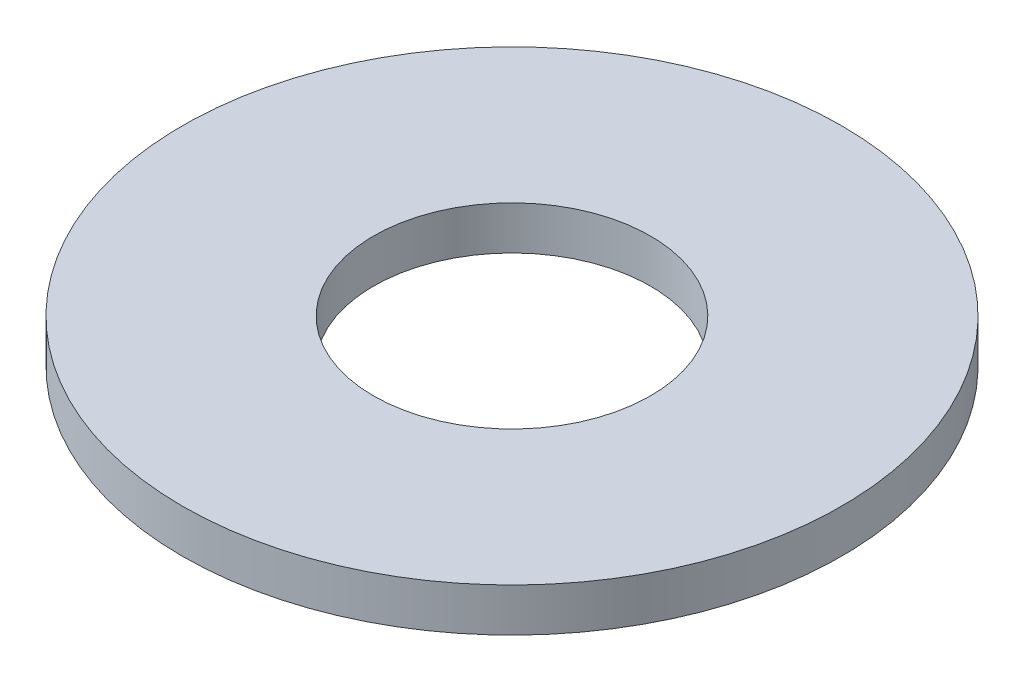
ISO-10303-21;
HEADER;
FILE_DESCRIPTION(('STEP AP214'),'2;1');
FILE_NAME('part.step','',(''),(''),'','','');
FILE_SCHEMA(('AUTOMOTIVE_DESIGN { 1 0 10303 214 1 1 1 1 }'));
ENDSEC;
DATA;
#1=APPLICATION_CONTEXT('core data for automotive mechanical design processes');
#2=APPLICATION_PROTOCOL_DEFINITION('international standard','automotive_design',2000,#1);
#3=PRODUCT_CONTEXT('',#1,'mechanical');
#4=PRODUCT('Part','Part','',(#3));
#5=PRODUCT_RELATED_PRODUCT_CATEGORY('part','',(#4));
#6=PRODUCT_DEFINITION_FORMATION('','',#4);
#7=PRODUCT_DEFINITION_CONTEXT('part definition',#1,'design');
#8=PRODUCT_DEFINITION('design','',#6,#7);
#9=PRODUCT_DEFINITION_SHAPE('','',#8);
#10=(LENGTH_UNIT() NAMED_UNIT(*) SI_UNIT(.MILLI.,.METRE.));
#11=(NAMED_UNIT(*) PLANE_ANGLE_UNIT() SI_UNIT($,.RADIAN.));
#12=(NAMED_UNIT(*) SI_UNIT($,.STERADIAN.) SOLID_ANGLE_UNIT());
#13=UNCERTAINTY_MEASURE_WITH_UNIT(LENGTH_MEASURE(1.E-05),#10,'distance_accuracy_value','');
#14=(GEOMETRIC_REPRESENTATION_CONTEXT(3) GLOBAL_UNCERTAINTY_ASSIGNED_CONTEXT((#13)) GLOBAL_UNIT_ASSIGNED_CONTEXT((#10,
#11,#12)) REPRESENTATION_CONTEXT('',''));
#15=CARTESIAN_POINT('',(0.,0.,0.));
#16=DIRECTION('',(0.,0.,1.));
#17=DIRECTION('',(1.,0.,0.));
#18=AXIS2_PLACEMENT_3D('',#15,#16,#17);
#19=CARTESIAN_POINT('',(0.,5.,0.));
#20=DIRECTION('',(0.,1.,0.));
#21=DIRECTION('',(0.,0.,1.));
#22=AXIS2_PLACEMENT_3D('',#19,#20,#21);
#23=PLANE('',#22);
#24=CARTESIAN_POINT('',(0.,5.,0.));
#25=DIRECTION('',(0.,1.,0.));
#26=DIRECTION('',(0.,0.,1.));
#27=AXIS2_PLACEMENT_3D('',#24,#25,#26);
#28=CIRCLE('',#27,37.95);
#29=CARTESIAN_POINT('',(0.,5.,37.95));
#30=VERTEX_POINT('',#29);
#31=EDGE_CURVE('E10',#30,#30,#28,.T.);
#32=ORIENTED_EDGE('',*,*,#31,.T.);
#33=EDGE_LOOP('',(#32));
#34=FACE_BOUND('',#33,.T.);
#35=CARTESIAN_POINT('',(0.,5.,0.));
#36=DIRECTION('',(0.,1.,0.));
#37=DIRECTION('',(0.,0.,1.));
#38=AXIS2_PLACEMENT_3D('',#35,#36,#37);
#39=CIRCLE('',#38,15.95);
#40=CARTESIAN_POINT('',(0.,5.,15.95));
#41=VERTEX_POINT('',#40);
#42=EDGE_CURVE('E50',#41,#41,#39,.T.);
#43=ORIENTED_EDGE('',*,*,#42,.F.);
#44=EDGE_LOOP('',(#43));
#45=FACE_BOUND('',#44,.T.);
#46=ADVANCED_FACE('F37',(#34,#45),#23,.T.);
#47=CARTESIAN_POINT('',(0.,0.,0.));
#48=DIRECTION('',(0.,1.,0.));
#49=DIRECTION('',(0.,0.,1.));
#50=AXIS2_PLACEMENT_3D('',#47,#48,#49);
#51=PLANE('',#50);
#52=CARTESIAN_POINT('',(0.,0.,0.));
#53=DIRECTION('',(0.,1.,0.));
#54=DIRECTION('',(0.,0.,1.));
#55=AXIS2_PLACEMENT_3D('',#52,#53,#54);
#56=CIRCLE('',#55,37.95);
#57=CARTESIAN_POINT('',(0.,0.,37.95));
#58=VERTEX_POINT('',#57);
#59=EDGE_CURVE('E41',#58,#58,#56,.T.);
#60=ORIENTED_EDGE('',*,*,#59,.F.);
#61=EDGE_LOOP('',(#60));
#62=FACE_BOUND('',#61,.T.);
#63=CARTESIAN_POINT('',(0.,0.,0.));
#64=DIRECTION('',(0.,1.,0.));
#65=DIRECTION('',(0.,0.,1.));
#66=AXIS2_PLACEMENT_3D('',#63,#64,#65);
#67=CIRCLE('',#66,15.95);
#68=CARTESIAN_POINT('',(0.,0.,15.95));
#69=VERTEX_POINT('',#68);
#70=EDGE_CURVE('E52',#69,#69,#67,.T.);
#71=ORIENTED_EDGE('',*,*,#70,.T.);
#72=EDGE_LOOP('',(#71));
#73=FACE_BOUND('',#72,.T.);
#74=ADVANCED_FACE('F64',(#62,#73),#51,.F.);
#75=CARTESIAN_POINT('',(0.,5.,0.));
#76=DIRECTION('',(0.,-1.,0.));
#77=DIRECTION('',(0.,0.,-1.));
#78=AXIS2_PLACEMENT_3D('',#75,#76,#77);
#79=CYLINDRICAL_SURFACE('',#78,37.95);
#80=ORIENTED_EDGE('',*,*,#31,.F.);
#81=EDGE_LOOP('',(#80));
#82=FACE_BOUND('',#81,.T.);
#83=ORIENTED_EDGE('',*,*,#59,.T.);
#84=EDGE_LOOP('',(#83));
#85=FACE_BOUND('',#84,.T.);
#86=ADVANCED_FACE('F39',(#82,#85),#79,.T.);
#87=CARTESIAN_POINT('',(0.,5.,0.));
#88=DIRECTION('',(0.,-1.,0.));
#89=DIRECTION('',(0.,0.,-1.));
#90=AXIS2_PLACEMENT_3D('',#87,#88,#89);
#91=CYLINDRICAL_SURFACE('',#90,15.95);
#92=ORIENTED_EDGE('',*,*,#42,.T.);
#93=EDGE_LOOP('',(#92));
#94=FACE_BOUND('',#93,.T.);
#95=ORIENTED_EDGE('',*,*,#70,.F.);
#96=EDGE_LOOP('',(#95));
#97=FACE_BOUND('',#96,.T.);
#98=ADVANCED_FACE('F60',(#94,#97),#91,.F.);
#99=CLOSED_SHELL('',(#46,#74,#86,#98));
#100=MANIFOLD_SOLID_BREP('B2',#99);
#101=ADVANCED_BREP_SHAPE_REPRESENTATION('',(#18,#100),#14);
#102=SHAPE_DEFINITION_REPRESENTATION(#9,#101);
ENDSEC;
END-ISO-10303-21;
